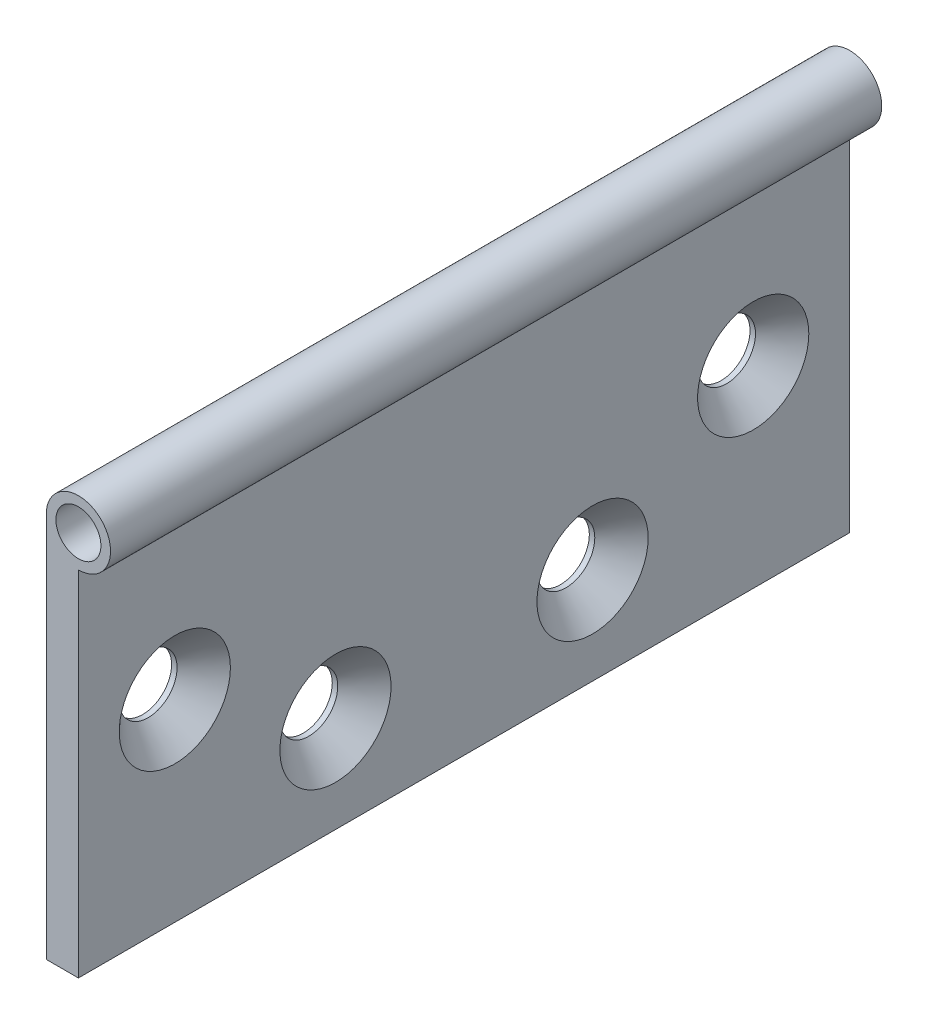
ISO-10303-21;
HEADER;
FILE_DESCRIPTION(('STEP AP214'),'2;1');
FILE_NAME('part.step','',(''),(''),'','','');
FILE_SCHEMA(('AUTOMOTIVE_DESIGN { 1 0 10303 214 1 1 1 1 }'));
ENDSEC;
DATA;
#1=APPLICATION_CONTEXT('core data for automotive mechanical design processes');
#2=APPLICATION_PROTOCOL_DEFINITION('international standard','automotive_design',2000,#1);
#3=PRODUCT_CONTEXT('',#1,'mechanical');
#4=PRODUCT('Part','Part','',(#3));
#5=PRODUCT_RELATED_PRODUCT_CATEGORY('part','',(#4));
#6=PRODUCT_DEFINITION_FORMATION('','',#4);
#7=PRODUCT_DEFINITION_CONTEXT('part definition',#1,'design');
#8=PRODUCT_DEFINITION('design','',#6,#7);
#9=PRODUCT_DEFINITION_SHAPE('','',#8);
#10=(LENGTH_UNIT() NAMED_UNIT(*) SI_UNIT(.MILLI.,.METRE.));
#11=(NAMED_UNIT(*) PLANE_ANGLE_UNIT() SI_UNIT($,.RADIAN.));
#12=(NAMED_UNIT(*) SI_UNIT($,.STERADIAN.) SOLID_ANGLE_UNIT());
#13=UNCERTAINTY_MEASURE_WITH_UNIT(LENGTH_MEASURE(1.E-05),#10,'distance_accuracy_value','');
#14=(GEOMETRIC_REPRESENTATION_CONTEXT(3) GLOBAL_UNCERTAINTY_ASSIGNED_CONTEXT((#13)) GLOBAL_UNIT_ASSIGNED_CONTEXT((#10,
#11,#12)) REPRESENTATION_CONTEXT('',''));
#15=CARTESIAN_POINT('',(0.,0.,0.));
#16=DIRECTION('',(0.,0.,1.));
#17=DIRECTION('',(1.,0.,0.));
#18=AXIS2_PLACEMENT_3D('',#15,#16,#17);
#19=CARTESIAN_POINT('',(5.,0.,60.));
#20=DIRECTION('',(-1.,0.,0.));
#21=DIRECTION('',(0.,0.,1.));
#22=AXIS2_PLACEMENT_3D('',#19,#20,#21);
#23=PLANE('',#22);
#24=CARTESIAN_POINT('',(5.,30.,-45.));
#25=DIRECTION('',(1.,0.,0.));
#26=DIRECTION('',(0.,0.,-1.));
#27=AXIS2_PLACEMENT_3D('',#24,#25,#26);
#28=CIRCLE('',#27,8.65);
#29=CARTESIAN_POINT('',(5.,30.,-53.65));
#30=VERTEX_POINT('',#29);
#31=EDGE_CURVE('E134',#30,#30,#28,.T.);
#32=ORIENTED_EDGE('',*,*,#31,.F.);
#33=EDGE_LOOP('',(#32));
#34=FACE_BOUND('',#33,.T.);
#35=CARTESIAN_POINT('',(5.,15.,-20.));
#36=DIRECTION('',(1.,0.,0.));
#37=DIRECTION('',(0.,0.,-1.));
#38=AXIS2_PLACEMENT_3D('',#35,#36,#37);
#39=CIRCLE('',#38,8.65);
#40=CARTESIAN_POINT('',(5.,15.,-28.65));
#41=VERTEX_POINT('',#40);
#42=EDGE_CURVE('E125',#41,#41,#39,.T.);
#43=ORIENTED_EDGE('',*,*,#42,.F.);
#44=EDGE_LOOP('',(#43));
#45=FACE_BOUND('',#44,.T.);
#46=CARTESIAN_POINT('',(5.,30.,45.));
#47=DIRECTION('',(1.,0.,0.));
#48=DIRECTION('',(0.,0.,-1.));
#49=AXIS2_PLACEMENT_3D('',#46,#47,#48);
#50=CIRCLE('',#49,8.65);
#51=CARTESIAN_POINT('',(5.,30.,36.35));
#52=VERTEX_POINT('',#51);
#53=EDGE_CURVE('E116',#52,#52,#50,.T.);
#54=ORIENTED_EDGE('',*,*,#53,.F.);
#55=EDGE_LOOP('',(#54));
#56=FACE_BOUND('',#55,.T.);
#57=CARTESIAN_POINT('',(5.,15.,20.));
#58=DIRECTION('',(1.,0.,0.));
#59=DIRECTION('',(0.,0.,-1.));
#60=AXIS2_PLACEMENT_3D('',#57,#58,#59);
#61=CIRCLE('',#60,8.65);
#62=CARTESIAN_POINT('',(5.,15.,11.35));
#63=VERTEX_POINT('',#62);
#64=EDGE_CURVE('E107',#63,#63,#61,.T.);
#65=ORIENTED_EDGE('',*,*,#64,.F.);
#66=EDGE_LOOP('',(#65));
#67=FACE_BOUND('',#66,.T.);
#68=DIRECTION('',(0.,1.,0.));
#69=VECTOR('',#68,1.);
#70=CARTESIAN_POINT('',(5.,0.,-60.));
#71=LINE('',#70,#69);
#72=CARTESIAN_POINT('',(5.,0.,-60.));
#73=VERTEX_POINT('',#72);
#74=CARTESIAN_POINT('',(5.,55.,-60.));
#75=VERTEX_POINT('',#74);
#76=EDGE_CURVE('E65',#73,#75,#71,.T.);
#77=ORIENTED_EDGE('',*,*,#76,.T.);
#78=DIRECTION('',(0.,0.,1.));
#79=VECTOR('',#78,1.);
#80=CARTESIAN_POINT('',(5.,55.,-60.));
#81=LINE('',#80,#79);
#82=CARTESIAN_POINT('',(5.,55.,60.));
#83=VERTEX_POINT('',#82);
#84=EDGE_CURVE('E79',#75,#83,#81,.T.);
#85=ORIENTED_EDGE('',*,*,#84,.T.);
#86=DIRECTION('',(0.,1.,0.));
#87=VECTOR('',#86,1.);
#88=CARTESIAN_POINT('',(5.,0.,60.));
#89=LINE('',#88,#87);
#90=CARTESIAN_POINT('',(5.,0.,60.));
#91=VERTEX_POINT('',#90);
#92=EDGE_CURVE('E67',#91,#83,#89,.T.);
#93=ORIENTED_EDGE('',*,*,#92,.F.);
#94=DIRECTION('',(0.,0.,-1.));
#95=VECTOR('',#94,1.);
#96=CARTESIAN_POINT('',(5.,0.,60.));
#97=LINE('',#96,#95);
#98=EDGE_CURVE('E48',#91,#73,#97,.T.);
#99=ORIENTED_EDGE('',*,*,#98,.T.);
#100=EDGE_LOOP('',(#77,#85,#93,#99));
#101=FACE_BOUND('',#100,.T.);
#102=ADVANCED_FACE('F32',(#34,#45,#56,#67,#101),#23,.F.);
#103=CARTESIAN_POINT('',(0.,0.,60.));
#104=DIRECTION('',(-1.,0.,0.));
#105=DIRECTION('',(0.,0.,1.));
#106=AXIS2_PLACEMENT_3D('',#103,#104,#105);
#107=PLANE('',#106);
#108=CARTESIAN_POINT('',(0.,30.,-45.));
#109=DIRECTION('',(1.,0.,0.));
#110=DIRECTION('',(0.,0.,-1.));
#111=AXIS2_PLACEMENT_3D('',#108,#109,#110);
#112=CIRCLE('',#111,4.5);
#113=CARTESIAN_POINT('',(0.,30.,-49.5));
#114=VERTEX_POINT('',#113);
#115=EDGE_CURVE('E128',#114,#114,#112,.T.);
#116=ORIENTED_EDGE('',*,*,#115,.T.);
#117=EDGE_LOOP('',(#116));
#118=FACE_BOUND('',#117,.T.);
#119=CARTESIAN_POINT('',(0.,15.,-20.));
#120=DIRECTION('',(1.,0.,0.));
#121=DIRECTION('',(0.,0.,-1.));
#122=AXIS2_PLACEMENT_3D('',#119,#120,#121);
#123=CIRCLE('',#122,4.5);
#124=CARTESIAN_POINT('',(0.,15.,-24.5));
#125=VERTEX_POINT('',#124);
#126=EDGE_CURVE('E119',#125,#125,#123,.T.);
#127=ORIENTED_EDGE('',*,*,#126,.T.);
#128=EDGE_LOOP('',(#127));
#129=FACE_BOUND('',#128,.T.);
#130=CARTESIAN_POINT('',(0.,30.,45.));
#131=DIRECTION('',(1.,0.,0.));
#132=DIRECTION('',(0.,0.,-1.));
#133=AXIS2_PLACEMENT_3D('',#130,#131,#132);
#134=CIRCLE('',#133,4.5);
#135=CARTESIAN_POINT('',(0.,30.,40.5));
#136=VERTEX_POINT('',#135);
#137=EDGE_CURVE('E110',#136,#136,#134,.T.);
#138=ORIENTED_EDGE('',*,*,#137,.T.);
#139=EDGE_LOOP('',(#138));
#140=FACE_BOUND('',#139,.T.);
#141=CARTESIAN_POINT('',(0.,15.,20.));
#142=DIRECTION('',(1.,0.,0.));
#143=DIRECTION('',(0.,0.,-1.));
#144=AXIS2_PLACEMENT_3D('',#141,#142,#143);
#145=CIRCLE('',#144,4.5);
#146=CARTESIAN_POINT('',(0.,15.,15.5));
#147=VERTEX_POINT('',#146);
#148=EDGE_CURVE('E99',#147,#147,#145,.T.);
#149=ORIENTED_EDGE('',*,*,#148,.T.);
#150=EDGE_LOOP('',(#149));
#151=FACE_BOUND('',#150,.T.);
#152=DIRECTION('',(0.,1.,0.));
#153=VECTOR('',#152,1.);
#154=CARTESIAN_POINT('',(0.,0.,-60.));
#155=LINE('',#154,#153);
#156=CARTESIAN_POINT('',(0.,0.,-60.));
#157=VERTEX_POINT('',#156);
#158=CARTESIAN_POINT('',(0.,60.,-60.));
#159=VERTEX_POINT('',#158);
#160=EDGE_CURVE('E78',#157,#159,#155,.T.);
#161=ORIENTED_EDGE('',*,*,#160,.F.);
#162=DIRECTION('',(0.,0.,-1.));
#163=VECTOR('',#162,1.);
#164=CARTESIAN_POINT('',(0.,0.,60.));
#165=LINE('',#164,#163);
#166=CARTESIAN_POINT('',(0.,0.,60.));
#167=VERTEX_POINT('',#166);
#168=EDGE_CURVE('E40',#167,#157,#165,.T.);
#169=ORIENTED_EDGE('',*,*,#168,.F.);
#170=DIRECTION('',(0.,1.,0.));
#171=VECTOR('',#170,1.);
#172=CARTESIAN_POINT('',(0.,0.,60.));
#173=LINE('',#172,#171);
#174=CARTESIAN_POINT('',(0.,60.,60.));
#175=VERTEX_POINT('',#174);
#176=EDGE_CURVE('E83',#167,#175,#173,.T.);
#177=ORIENTED_EDGE('',*,*,#176,.T.);
#178=DIRECTION('',(0.,0.,-1.));
#179=VECTOR('',#178,1.);
#180=CARTESIAN_POINT('',(0.,60.,60.));
#181=LINE('',#180,#179);
#182=EDGE_CURVE('E11',#175,#159,#181,.T.);
#183=ORIENTED_EDGE('',*,*,#182,.T.);
#184=EDGE_LOOP('',(#161,#169,#177,#183));
#185=FACE_BOUND('',#184,.T.);
#186=ADVANCED_FACE('F142',(#118,#129,#140,#151,#185),#107,.T.);
#187=CARTESIAN_POINT('',(5.,0.,60.));
#188=DIRECTION('',(0.,-1.,0.));
#189=DIRECTION('',(0.,0.,-1.));
#190=AXIS2_PLACEMENT_3D('',#187,#188,#189);
#191=PLANE('',#190);
#192=DIRECTION('',(-1.,0.,0.));
#193=VECTOR('',#192,1.);
#194=CARTESIAN_POINT('',(5.,0.,-60.));
#195=LINE('',#194,#193);
#196=EDGE_CURVE('E76',#73,#157,#195,.T.);
#197=ORIENTED_EDGE('',*,*,#196,.F.);
#198=ORIENTED_EDGE('',*,*,#98,.F.);
#199=DIRECTION('',(-1.,0.,0.));
#200=VECTOR('',#199,1.);
#201=CARTESIAN_POINT('',(5.,0.,60.));
#202=LINE('',#201,#200);
#203=EDGE_CURVE('E69',#91,#167,#202,.T.);
#204=ORIENTED_EDGE('',*,*,#203,.T.);
#205=ORIENTED_EDGE('',*,*,#168,.T.);
#206=EDGE_LOOP('',(#197,#198,#204,#205));
#207=FACE_BOUND('',#206,.T.);
#208=ADVANCED_FACE('F81',(#207),#191,.T.);
#209=CARTESIAN_POINT('',(0.,0.,60.));
#210=DIRECTION('',(0.,0.,-1.));
#211=DIRECTION('',(-1.,0.,0.));
#212=AXIS2_PLACEMENT_3D('',#209,#210,#211);
#213=PLANE('',#212);
#214=CARTESIAN_POINT('',(5.,60.,60.));
#215=DIRECTION('',(0.,0.,1.));
#216=DIRECTION('',(1.,0.,0.));
#217=AXIS2_PLACEMENT_3D('',#214,#215,#216);
#218=CIRCLE('',#217,3.5);
#219=CARTESIAN_POINT('',(8.5,60.,60.));
#220=VERTEX_POINT('',#219);
#221=EDGE_CURVE('E96',#220,#220,#218,.T.);
#222=ORIENTED_EDGE('',*,*,#221,.F.);
#223=EDGE_LOOP('',(#222));
#224=FACE_BOUND('',#223,.T.);
#225=ORIENTED_EDGE('',*,*,#92,.T.);
#226=CARTESIAN_POINT('',(5.,60.,60.));
#227=DIRECTION('',(0.,0.,1.));
#228=DIRECTION('',(1.,0.,0.));
#229=AXIS2_PLACEMENT_3D('',#226,#227,#228);
#230=CIRCLE('',#229,5.);
#231=EDGE_CURVE('E91',#83,#175,#230,.T.);
#232=ORIENTED_EDGE('',*,*,#231,.T.);
#233=ORIENTED_EDGE('',*,*,#176,.F.);
#234=ORIENTED_EDGE('',*,*,#203,.F.);
#235=EDGE_LOOP('',(#225,#232,#233,#234));
#236=FACE_BOUND('',#235,.T.);
#237=ADVANCED_FACE('F175',(#224,#236),#213,.F.);
#238=CARTESIAN_POINT('',(0.,0.,-60.));
#239=DIRECTION('',(0.,0.,-1.));
#240=DIRECTION('',(-1.,0.,0.));
#241=AXIS2_PLACEMENT_3D('',#238,#239,#240);
#242=PLANE('',#241);
#243=CARTESIAN_POINT('',(5.,60.,-60.));
#244=DIRECTION('',(0.,0.,1.));
#245=DIRECTION('',(1.,0.,0.));
#246=AXIS2_PLACEMENT_3D('',#243,#244,#245);
#247=CIRCLE('',#246,3.5);
#248=CARTESIAN_POINT('',(8.5,60.,-60.));
#249=VERTEX_POINT('',#248);
#250=EDGE_CURVE('E94',#249,#249,#247,.T.);
#251=ORIENTED_EDGE('',*,*,#250,.T.);
#252=EDGE_LOOP('',(#251));
#253=FACE_BOUND('',#252,.T.);
#254=ORIENTED_EDGE('',*,*,#160,.T.);
#255=CARTESIAN_POINT('',(5.,60.,-60.));
#256=DIRECTION('',(0.,0.,1.));
#257=DIRECTION('',(1.,0.,0.));
#258=AXIS2_PLACEMENT_3D('',#255,#256,#257);
#259=CIRCLE('',#258,5.);
#260=EDGE_CURVE('E77',#75,#159,#259,.T.);
#261=ORIENTED_EDGE('',*,*,#260,.F.);
#262=ORIENTED_EDGE('',*,*,#76,.F.);
#263=ORIENTED_EDGE('',*,*,#196,.T.);
#264=EDGE_LOOP('',(#254,#261,#262,#263));
#265=FACE_BOUND('',#264,.T.);
#266=ADVANCED_FACE('F75',(#253,#265),#242,.T.);
#267=CARTESIAN_POINT('',(5.,60.,-60.));
#268=DIRECTION('',(0.,0.,1.));
#269=DIRECTION('',(1.,0.,0.));
#270=AXIS2_PLACEMENT_3D('',#267,#268,#269);
#271=CYLINDRICAL_SURFACE('',#270,5.);
#272=ORIENTED_EDGE('',*,*,#84,.F.);
#273=ORIENTED_EDGE('',*,*,#260,.T.);
#274=ORIENTED_EDGE('',*,*,#182,.F.);
#275=ORIENTED_EDGE('',*,*,#231,.F.);
#276=EDGE_LOOP('',(#272,#273,#274,#275));
#277=FACE_BOUND('',#276,.T.);
#278=ADVANCED_FACE('F170',(#277),#271,.T.);
#279=CARTESIAN_POINT('',(5.,60.,-60.));
#280=DIRECTION('',(0.,0.,1.));
#281=DIRECTION('',(1.,0.,0.));
#282=AXIS2_PLACEMENT_3D('',#279,#280,#281);
#283=CYLINDRICAL_SURFACE('',#282,3.5);
#284=ORIENTED_EDGE('',*,*,#250,.F.);
#285=EDGE_LOOP('',(#284));
#286=FACE_BOUND('',#285,.T.);
#287=ORIENTED_EDGE('',*,*,#221,.T.);
#288=EDGE_LOOP('',(#287));
#289=FACE_BOUND('',#288,.T.);
#290=ADVANCED_FACE('F162',(#286,#289),#283,.F.);
#291=CARTESIAN_POINT('',(5.,15.,20.));
#292=DIRECTION('',(1.,0.,0.));
#293=DIRECTION('',(0.,0.,-1.));
#294=AXIS2_PLACEMENT_3D('',#291,#292,#293);
#295=CYLINDRICAL_SURFACE('',#294,4.5);
#296=ORIENTED_EDGE('',*,*,#148,.F.);
#297=EDGE_LOOP('',(#296));
#298=FACE_BOUND('',#297,.T.);
#299=CARTESIAN_POINT('',(0.850000000000003,15.,20.));
#300=DIRECTION('',(1.,0.,0.));
#301=DIRECTION('',(0.,0.,-1.));
#302=AXIS2_PLACEMENT_3D('',#299,#300,#301);
#303=CIRCLE('',#302,4.5);
#304=CARTESIAN_POINT('',(0.850000000000003,15.,15.5));
#305=VERTEX_POINT('',#304);
#306=EDGE_CURVE('E104',#305,#305,#303,.T.);
#307=ORIENTED_EDGE('',*,*,#306,.T.);
#308=EDGE_LOOP('',(#307));
#309=FACE_BOUND('',#308,.T.);
#310=ADVANCED_FACE('F152',(#298,#309),#295,.F.);
#311=CARTESIAN_POINT('',(5.,15.,20.));
#312=DIRECTION('',(1.,0.,0.));
#313=DIRECTION('',(0.,0.,-1.));
#314=AXIS2_PLACEMENT_3D('',#311,#312,#313);
#315=CONICAL_SURFACE('',#314,8.65,0.785398163397448);
#316=ORIENTED_EDGE('',*,*,#306,.F.);
#317=EDGE_LOOP('',(#316));
#318=FACE_BOUND('',#317,.T.);
#319=ORIENTED_EDGE('',*,*,#64,.T.);
#320=EDGE_LOOP('',(#319));
#321=FACE_BOUND('',#320,.T.);
#322=ADVANCED_FACE('F149',(#318,#321),#315,.F.);
#323=CARTESIAN_POINT('',(5.,30.,45.));
#324=DIRECTION('',(1.,0.,0.));
#325=DIRECTION('',(0.,0.,-1.));
#326=AXIS2_PLACEMENT_3D('',#323,#324,#325);
#327=CYLINDRICAL_SURFACE('',#326,4.5);
#328=ORIENTED_EDGE('',*,*,#137,.F.);
#329=EDGE_LOOP('',(#328));
#330=FACE_BOUND('',#329,.T.);
#331=CARTESIAN_POINT('',(0.850000000000003,30.,45.));
#332=DIRECTION('',(1.,0.,0.));
#333=DIRECTION('',(0.,0.,-1.));
#334=AXIS2_PLACEMENT_3D('',#331,#332,#333);
#335=CIRCLE('',#334,4.5);
#336=CARTESIAN_POINT('',(0.850000000000003,30.,40.5));
#337=VERTEX_POINT('',#336);
#338=EDGE_CURVE('E113',#337,#337,#335,.T.);
#339=ORIENTED_EDGE('',*,*,#338,.T.);
#340=EDGE_LOOP('',(#339));
#341=FACE_BOUND('',#340,.T.);
#342=ADVANCED_FACE('F151',(#330,#341),#327,.F.);
#343=CARTESIAN_POINT('',(5.,30.,45.));
#344=DIRECTION('',(1.,0.,0.));
#345=DIRECTION('',(0.,0.,-1.));
#346=AXIS2_PLACEMENT_3D('',#343,#344,#345);
#347=CONICAL_SURFACE('',#346,8.65,0.785398163397449);
#348=ORIENTED_EDGE('',*,*,#338,.F.);
#349=EDGE_LOOP('',(#348));
#350=FACE_BOUND('',#349,.T.);
#351=ORIENTED_EDGE('',*,*,#53,.T.);
#352=EDGE_LOOP('',(#351));
#353=FACE_BOUND('',#352,.T.);
#354=ADVANCED_FACE('F159',(#350,#353),#347,.F.);
#355=CARTESIAN_POINT('',(5.,15.,-20.));
#356=DIRECTION('',(1.,0.,0.));
#357=DIRECTION('',(0.,0.,-1.));
#358=AXIS2_PLACEMENT_3D('',#355,#356,#357);
#359=CYLINDRICAL_SURFACE('',#358,4.5);
#360=ORIENTED_EDGE('',*,*,#126,.F.);
#361=EDGE_LOOP('',(#360));
#362=FACE_BOUND('',#361,.T.);
#363=CARTESIAN_POINT('',(0.850000000000003,15.,-20.));
#364=DIRECTION('',(1.,0.,0.));
#365=DIRECTION('',(0.,0.,-1.));
#366=AXIS2_PLACEMENT_3D('',#363,#364,#365);
#367=CIRCLE('',#366,4.5);
#368=CARTESIAN_POINT('',(0.850000000000003,15.,-24.5));
#369=VERTEX_POINT('',#368);
#370=EDGE_CURVE('E122',#369,#369,#367,.T.);
#371=ORIENTED_EDGE('',*,*,#370,.T.);
#372=EDGE_LOOP('',(#371));
#373=FACE_BOUND('',#372,.T.);
#374=ADVANCED_FACE('F209',(#362,#373),#359,.F.);
#375=CARTESIAN_POINT('',(5.,15.,-20.));
#376=DIRECTION('',(1.,0.,0.));
#377=DIRECTION('',(0.,0.,-1.));
#378=AXIS2_PLACEMENT_3D('',#375,#376,#377);
#379=CONICAL_SURFACE('',#378,8.65,0.785398163397448);
#380=ORIENTED_EDGE('',*,*,#370,.F.);
#381=EDGE_LOOP('',(#380));
#382=FACE_BOUND('',#381,.T.);
#383=ORIENTED_EDGE('',*,*,#42,.T.);
#384=EDGE_LOOP('',(#383));
#385=FACE_BOUND('',#384,.T.);
#386=ADVANCED_FACE('F213',(#382,#385),#379,.F.);
#387=CARTESIAN_POINT('',(5.,30.,-45.));
#388=DIRECTION('',(1.,0.,0.));
#389=DIRECTION('',(0.,0.,-1.));
#390=AXIS2_PLACEMENT_3D('',#387,#388,#389);
#391=CYLINDRICAL_SURFACE('',#390,4.5);
#392=ORIENTED_EDGE('',*,*,#115,.F.);
#393=EDGE_LOOP('',(#392));
#394=FACE_BOUND('',#393,.T.);
#395=CARTESIAN_POINT('',(0.850000000000003,30.,-45.));
#396=DIRECTION('',(1.,0.,0.));
#397=DIRECTION('',(0.,0.,-1.));
#398=AXIS2_PLACEMENT_3D('',#395,#396,#397);
#399=CIRCLE('',#398,4.5);
#400=CARTESIAN_POINT('',(0.850000000000003,30.,-49.5));
#401=VERTEX_POINT('',#400);
#402=EDGE_CURVE('E131',#401,#401,#399,.T.);
#403=ORIENTED_EDGE('',*,*,#402,.T.);
#404=EDGE_LOOP('',(#403));
#405=FACE_BOUND('',#404,.T.);
#406=ADVANCED_FACE('F219',(#394,#405),#391,.F.);
#407=CARTESIAN_POINT('',(5.,30.,-45.));
#408=DIRECTION('',(1.,0.,0.));
#409=DIRECTION('',(0.,0.,-1.));
#410=AXIS2_PLACEMENT_3D('',#407,#408,#409);
#411=CONICAL_SURFACE('',#410,8.65,0.785398163397449);
#412=ORIENTED_EDGE('',*,*,#402,.F.);
#413=EDGE_LOOP('',(#412));
#414=FACE_BOUND('',#413,.T.);
#415=ORIENTED_EDGE('',*,*,#31,.T.);
#416=EDGE_LOOP('',(#415));
#417=FACE_BOUND('',#416,.T.);
#418=ADVANCED_FACE('F138',(#414,#417),#411,.F.);
#419=CLOSED_SHELL('',(#102,#186,#208,#237,#266,#278,#290,#310,#322,#342,#354,#374,#386,#406,#418));
#420=MANIFOLD_SOLID_BREP('B2',#419);
#421=ADVANCED_BREP_SHAPE_REPRESENTATION('',(#18,#420),#14);
#422=SHAPE_DEFINITION_REPRESENTATION(#9,#421);
ENDSEC;
END-ISO-10303-21;
